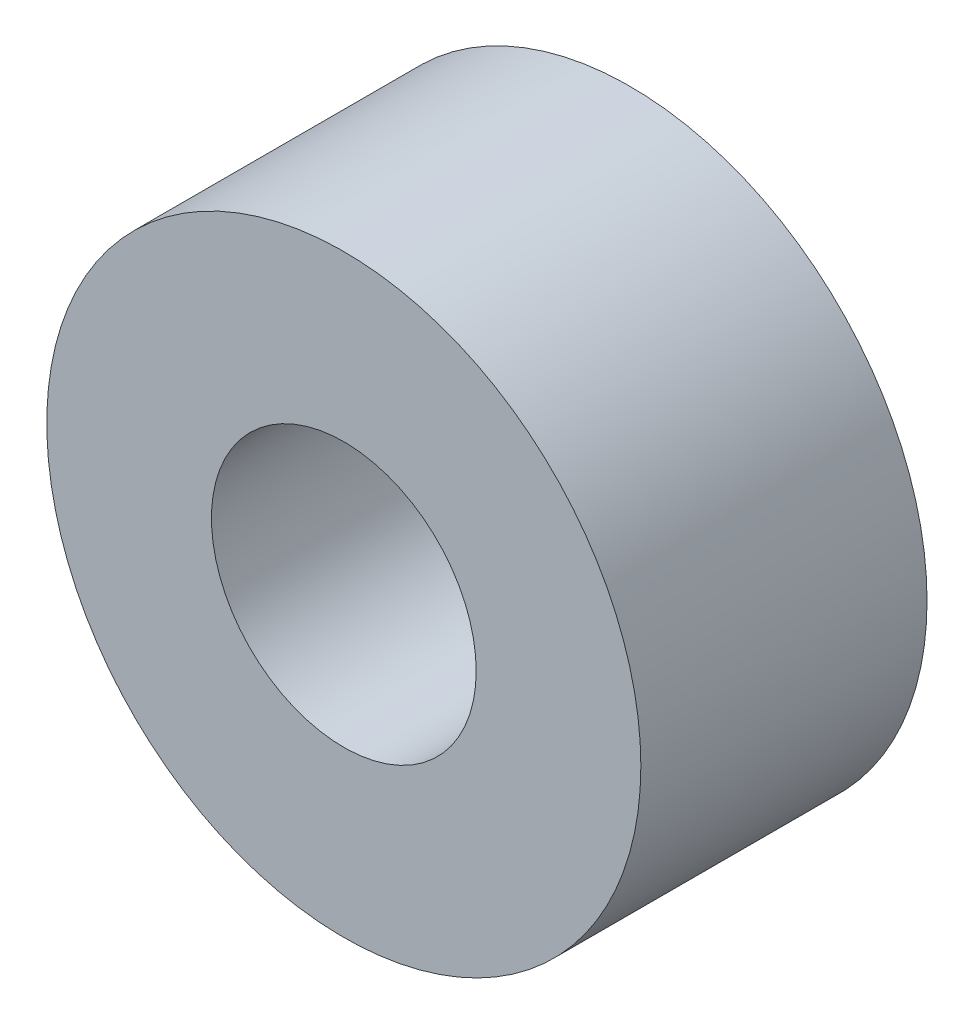
ISO-10303-21;
HEADER;
FILE_DESCRIPTION(('STEP AP214'),'2;1');
FILE_NAME('part.step','',(''),(''),'','','');
FILE_SCHEMA(('AUTOMOTIVE_DESIGN { 1 0 10303 214 1 1 1 1 }'));
ENDSEC;
DATA;
#1=APPLICATION_CONTEXT('core data for automotive mechanical design processes');
#2=APPLICATION_PROTOCOL_DEFINITION('international standard','automotive_design',2000,#1);
#3=PRODUCT_CONTEXT('',#1,'mechanical');
#4=PRODUCT('Part','Part','',(#3));
#5=PRODUCT_RELATED_PRODUCT_CATEGORY('part','',(#4));
#6=PRODUCT_DEFINITION_FORMATION('','',#4);
#7=PRODUCT_DEFINITION_CONTEXT('part definition',#1,'design');
#8=PRODUCT_DEFINITION('design','',#6,#7);
#9=PRODUCT_DEFINITION_SHAPE('','',#8);
#10=(LENGTH_UNIT() NAMED_UNIT(*) SI_UNIT(.MILLI.,.METRE.));
#11=(NAMED_UNIT(*) PLANE_ANGLE_UNIT() SI_UNIT($,.RADIAN.));
#12=(NAMED_UNIT(*) SI_UNIT($,.STERADIAN.) SOLID_ANGLE_UNIT());
#13=UNCERTAINTY_MEASURE_WITH_UNIT(LENGTH_MEASURE(1.E-05),#10,'distance_accuracy_value','');
#14=(GEOMETRIC_REPRESENTATION_CONTEXT(3) GLOBAL_UNCERTAINTY_ASSIGNED_CONTEXT((#13)) GLOBAL_UNIT_ASSIGNED_CONTEXT((#10,
#11,#12)) REPRESENTATION_CONTEXT('',''));
#15=CARTESIAN_POINT('',(0.,0.,0.));
#16=DIRECTION('',(0.,0.,1.));
#17=DIRECTION('',(1.,0.,0.));
#18=AXIS2_PLACEMENT_3D('',#15,#16,#17);
#19=CARTESIAN_POINT('',(0.,0.,6.02615));
#20=DIRECTION('',(0.,0.,1.));
#21=DIRECTION('',(1.,0.,0.));
#22=AXIS2_PLACEMENT_3D('',#19,#20,#21);
#23=PLANE('',#22);
#24=CARTESIAN_POINT('',(0.,0.,6.02615));
#25=DIRECTION('',(0.,0.,1.));
#26=DIRECTION('',(1.,0.,0.));
#27=AXIS2_PLACEMENT_3D('',#24,#25,#26);
#28=CIRCLE('',#27,12.5095);
#29=CARTESIAN_POINT('',(12.5095,0.,6.02615));
#30=VERTEX_POINT('',#29);
#31=EDGE_CURVE('E10',#30,#30,#28,.T.);
#32=ORIENTED_EDGE('',*,*,#31,.T.);
#33=EDGE_LOOP('',(#32));
#34=FACE_BOUND('',#33,.T.);
#35=CARTESIAN_POINT('',(0.,0.,6.02615));
#36=DIRECTION('',(0.,0.,1.));
#37=DIRECTION('',(1.,0.,0.));
#38=AXIS2_PLACEMENT_3D('',#35,#36,#37);
#39=CIRCLE('',#38,5.5753);
#40=CARTESIAN_POINT('',(5.5753,0.,6.02615));
#41=VERTEX_POINT('',#40);
#42=EDGE_CURVE('E41',#41,#41,#39,.T.);
#43=ORIENTED_EDGE('',*,*,#42,.F.);
#44=EDGE_LOOP('',(#43));
#45=FACE_BOUND('',#44,.T.);
#46=ADVANCED_FACE('F30',(#34,#45),#23,.T.);
#47=CARTESIAN_POINT('',(0.,0.,-6.02615));
#48=DIRECTION('',(0.,0.,1.));
#49=DIRECTION('',(1.,0.,0.));
#50=AXIS2_PLACEMENT_3D('',#47,#48,#49);
#51=PLANE('',#50);
#52=CARTESIAN_POINT('',(0.,0.,-6.02615));
#53=DIRECTION('',(0.,0.,1.));
#54=DIRECTION('',(1.,0.,0.));
#55=AXIS2_PLACEMENT_3D('',#52,#53,#54);
#56=CIRCLE('',#55,12.5095);
#57=CARTESIAN_POINT('',(12.5095,0.,-6.02615));
#58=VERTEX_POINT('',#57);
#59=EDGE_CURVE('E34',#58,#58,#56,.T.);
#60=ORIENTED_EDGE('',*,*,#59,.F.);
#61=EDGE_LOOP('',(#60));
#62=FACE_BOUND('',#61,.T.);
#63=CARTESIAN_POINT('',(0.,0.,-6.02615));
#64=DIRECTION('',(0.,0.,1.));
#65=DIRECTION('',(1.,0.,0.));
#66=AXIS2_PLACEMENT_3D('',#63,#64,#65);
#67=CIRCLE('',#66,5.5753);
#68=CARTESIAN_POINT('',(5.5753,0.,-6.02615));
#69=VERTEX_POINT('',#68);
#70=EDGE_CURVE('E43',#69,#69,#67,.T.);
#71=ORIENTED_EDGE('',*,*,#70,.T.);
#72=EDGE_LOOP('',(#71));
#73=FACE_BOUND('',#72,.T.);
#74=ADVANCED_FACE('F53',(#62,#73),#51,.F.);
#75=CARTESIAN_POINT('',(0.,0.,6.02615));
#76=DIRECTION('',(0.,0.,-1.));
#77=DIRECTION('',(-1.,0.,0.));
#78=AXIS2_PLACEMENT_3D('',#75,#76,#77);
#79=CYLINDRICAL_SURFACE('',#78,12.5095);
#80=ORIENTED_EDGE('',*,*,#31,.F.);
#81=EDGE_LOOP('',(#80));
#82=FACE_BOUND('',#81,.T.);
#83=ORIENTED_EDGE('',*,*,#59,.T.);
#84=EDGE_LOOP('',(#83));
#85=FACE_BOUND('',#84,.T.);
#86=ADVANCED_FACE('F32',(#82,#85),#79,.T.);
#87=CARTESIAN_POINT('',(0.,0.,6.02615));
#88=DIRECTION('',(0.,0.,-1.));
#89=DIRECTION('',(-1.,0.,0.));
#90=AXIS2_PLACEMENT_3D('',#87,#88,#89);
#91=CYLINDRICAL_SURFACE('',#90,5.5753);
#92=ORIENTED_EDGE('',*,*,#42,.T.);
#93=EDGE_LOOP('',(#92));
#94=FACE_BOUND('',#93,.T.);
#95=ORIENTED_EDGE('',*,*,#70,.F.);
#96=EDGE_LOOP('',(#95));
#97=FACE_BOUND('',#96,.T.);
#98=ADVANCED_FACE('F49',(#94,#97),#91,.F.);
#99=CLOSED_SHELL('',(#46,#74,#86,#98));
#100=MANIFOLD_SOLID_BREP('B2',#99);
#101=ADVANCED_BREP_SHAPE_REPRESENTATION('',(#18,#100),#14);
#102=SHAPE_DEFINITION_REPRESENTATION(#9,#101);
ENDSEC;
END-ISO-10303-21;
